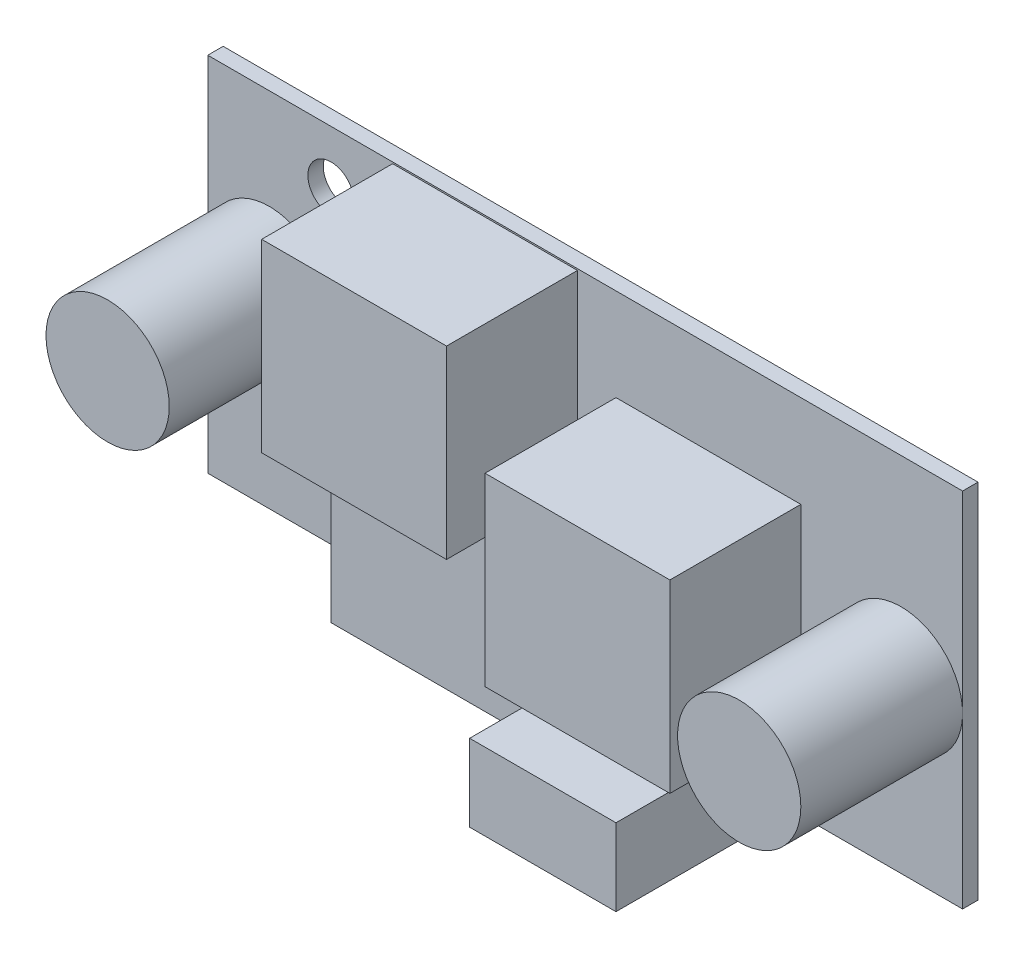
ISO-10303-21;
HEADER;
FILE_DESCRIPTION(('STEP AP214'),'2;1');
FILE_NAME('part.step','',(''),(''),'','','');
FILE_SCHEMA(('AUTOMOTIVE_DESIGN { 1 0 10303 214 1 1 1 1 }'));
ENDSEC;
DATA;
#1=APPLICATION_CONTEXT('core data for automotive mechanical design processes');
#2=APPLICATION_PROTOCOL_DEFINITION('international standard','automotive_design',2000,#1);
#3=PRODUCT_CONTEXT('',#1,'mechanical');
#4=PRODUCT('Part','Part','',(#3));
#5=PRODUCT_RELATED_PRODUCT_CATEGORY('part','',(#4));
#6=PRODUCT_DEFINITION_FORMATION('','',#4);
#7=PRODUCT_DEFINITION_CONTEXT('part definition',#1,'design');
#8=PRODUCT_DEFINITION('design','',#6,#7);
#9=PRODUCT_DEFINITION_SHAPE('','',#8);
#10=(LENGTH_UNIT() NAMED_UNIT(*) SI_UNIT(.MILLI.,.METRE.));
#11=(NAMED_UNIT(*) PLANE_ANGLE_UNIT() SI_UNIT($,.RADIAN.));
#12=(NAMED_UNIT(*) SI_UNIT($,.STERADIAN.) SOLID_ANGLE_UNIT());
#13=UNCERTAINTY_MEASURE_WITH_UNIT(LENGTH_MEASURE(1.E-05),#10,'distance_accuracy_value','');
#14=(GEOMETRIC_REPRESENTATION_CONTEXT(3) GLOBAL_UNCERTAINTY_ASSIGNED_CONTEXT((#13)) GLOBAL_UNIT_ASSIGNED_CONTEXT((#10,
#11,#12)) REPRESENTATION_CONTEXT('',''));
#15=CARTESIAN_POINT('',(0.,0.,0.));
#16=DIRECTION('',(0.,0.,1.));
#17=DIRECTION('',(1.,0.,0.));
#18=AXIS2_PLACEMENT_3D('',#15,#16,#17);
#19=CARTESIAN_POINT('',(0.,0.,1.));
#20=DIRECTION('',(0.,0.,1.));
#21=DIRECTION('',(1.,0.,0.));
#22=AXIS2_PLACEMENT_3D('',#19,#20,#21);
#23=PLANE('',#22);
#24=DIRECTION('',(0.,-1.,0.));
#25=VECTOR('',#24,1.);
#26=CARTESIAN_POINT('',(1.,0.,1.));
#27=LINE('',#26,#25);
#28=CARTESIAN_POINT('',(1.,-1.65,1.));
#29=VERTEX_POINT('',#28);
#30=CARTESIAN_POINT('',(1.,-11.65,1.));
#31=VERTEX_POINT('',#30);
#32=EDGE_CURVE('E200',#29,#31,#27,.T.);
#33=ORIENTED_EDGE('',*,*,#32,.T.);
#34=DIRECTION('',(1.,0.,0.));
#35=VECTOR('',#34,1.);
#36=CARTESIAN_POINT('',(0.,-11.65,1.));
#37=LINE('',#36,#35);
#38=CARTESIAN_POINT('',(-12.,-11.65,1.));
#39=VERTEX_POINT('',#38);
#40=EDGE_CURVE('E214',#39,#31,#37,.T.);
#41=ORIENTED_EDGE('',*,*,#40,.F.);
#42=DIRECTION('',(0.,-1.,0.));
#43=VECTOR('',#42,1.);
#44=CARTESIAN_POINT('',(-12.,0.,1.));
#45=LINE('',#44,#43);
#46=CARTESIAN_POINT('',(-12.,-1.65,1.));
#47=VERTEX_POINT('',#46);
#48=EDGE_CURVE('E227',#47,#39,#45,.T.);
#49=ORIENTED_EDGE('',*,*,#48,.F.);
#50=DIRECTION('',(1.,0.,0.));
#51=VECTOR('',#50,1.);
#52=CARTESIAN_POINT('',(0.,-1.65,1.));
#53=LINE('',#52,#51);
#54=EDGE_CURVE('E225',#47,#29,#53,.T.);
#55=ORIENTED_EDGE('',*,*,#54,.T.);
#56=EDGE_LOOP('',(#33,#41,#49,#55));
#57=FACE_BOUND('',#56,.T.);
#58=DIRECTION('',(0.,-1.,0.));
#59=VECTOR('',#58,1.);
#60=CARTESIAN_POINT('',(14.,0.,1.));
#61=LINE('',#60,#59);
#62=CARTESIAN_POINT('',(14.,5.75,1.));
#63=VERTEX_POINT('',#62);
#64=CARTESIAN_POINT('',(14.,-6.25,1.));
#65=VERTEX_POINT('',#64);
#66=EDGE_CURVE('E205',#63,#65,#61,.T.);
#67=ORIENTED_EDGE('',*,*,#66,.T.);
#68=DIRECTION('',(1.,0.,0.));
#69=VECTOR('',#68,1.);
#70=CARTESIAN_POINT('',(0.,-6.25,1.));
#71=LINE('',#70,#69);
#72=CARTESIAN_POINT('',(2.00000000000001,-6.25,1.));
#73=VERTEX_POINT('',#72);
#74=EDGE_CURVE('E237',#73,#65,#71,.T.);
#75=ORIENTED_EDGE('',*,*,#74,.F.);
#76=DIRECTION('',(0.,-1.,0.));
#77=VECTOR('',#76,1.);
#78=CARTESIAN_POINT('',(2.00000000000001,0.,1.));
#79=LINE('',#78,#77);
#80=CARTESIAN_POINT('',(2.00000000000001,5.75,1.));
#81=VERTEX_POINT('',#80);
#82=EDGE_CURVE('E250',#81,#73,#79,.T.);
#83=ORIENTED_EDGE('',*,*,#82,.F.);
#84=DIRECTION('',(1.,0.,0.));
#85=VECTOR('',#84,1.);
#86=CARTESIAN_POINT('',(0.,5.75,1.));
#87=LINE('',#86,#85);
#88=EDGE_CURVE('E247',#81,#63,#87,.T.);
#89=ORIENTED_EDGE('',*,*,#88,.T.);
#90=EDGE_LOOP('',(#67,#75,#83,#89));
#91=FACE_BOUND('',#90,.T.);
#92=DIRECTION('',(0.,-1.,0.));
#93=VECTOR('',#92,1.);
#94=CARTESIAN_POINT('',(-0.499999999999995,0.,1.));
#95=LINE('',#94,#93);
#96=CARTESIAN_POINT('',(-0.499999999999997,11.65,1.));
#97=VERTEX_POINT('',#96);
#98=CARTESIAN_POINT('',(-0.499999999999995,-0.349999999999999,1.));
#99=VERTEX_POINT('',#98);
#100=EDGE_CURVE('E259',#97,#99,#95,.T.);
#101=ORIENTED_EDGE('',*,*,#100,.T.);
#102=DIRECTION('',(1.,0.,0.));
#103=VECTOR('',#102,1.);
#104=CARTESIAN_POINT('',(0.,-0.349999999999999,1.));
#105=LINE('',#104,#103);
#106=CARTESIAN_POINT('',(-12.5,-0.349999999999999,1.));
#107=VERTEX_POINT('',#106);
#108=EDGE_CURVE('E264',#107,#99,#105,.T.);
#109=ORIENTED_EDGE('',*,*,#108,.F.);
#110=DIRECTION('',(0.,-1.,0.));
#111=VECTOR('',#110,1.);
#112=CARTESIAN_POINT('',(-12.5,0.,1.));
#113=LINE('',#112,#111);
#114=CARTESIAN_POINT('',(-12.5,11.65,1.));
#115=VERTEX_POINT('',#114);
#116=EDGE_CURVE('E277',#115,#107,#113,.T.);
#117=ORIENTED_EDGE('',*,*,#116,.F.);
#118=DIRECTION('',(1.,0.,0.));
#119=VECTOR('',#118,1.);
#120=CARTESIAN_POINT('',(0.,11.65,1.));
#121=LINE('',#120,#119);
#122=EDGE_CURVE('E274',#115,#97,#121,.T.);
#123=ORIENTED_EDGE('',*,*,#122,.T.);
#124=EDGE_LOOP('',(#101,#109,#117,#123));
#125=FACE_BOUND('',#124,.T.);
#126=DIRECTION('',(0.,-1.,0.));
#127=VECTOR('',#126,1.);
#128=CARTESIAN_POINT('',(13.5,0.,1.));
#129=LINE('',#128,#127);
#130=CARTESIAN_POINT('',(13.5,-6.65,1.));
#131=VERTEX_POINT('',#130);
#132=CARTESIAN_POINT('',(13.5,-11.65,1.));
#133=VERTEX_POINT('',#132);
#134=EDGE_CURVE('E289',#131,#133,#129,.T.);
#135=ORIENTED_EDGE('',*,*,#134,.T.);
#136=DIRECTION('',(1.,0.,0.));
#137=VECTOR('',#136,1.);
#138=CARTESIAN_POINT('',(0.,-11.65,1.));
#139=LINE('',#138,#137);
#140=CARTESIAN_POINT('',(4.00000000000001,-11.65,1.));
#141=VERTEX_POINT('',#140);
#142=EDGE_CURVE('E294',#141,#133,#139,.T.);
#143=ORIENTED_EDGE('',*,*,#142,.F.);
#144=DIRECTION('',(0.,-1.,0.));
#145=VECTOR('',#144,1.);
#146=CARTESIAN_POINT('',(4.00000000000001,0.,1.));
#147=LINE('',#146,#145);
#148=CARTESIAN_POINT('',(4.00000000000001,-6.65,1.));
#149=VERTEX_POINT('',#148);
#150=EDGE_CURVE('E307',#149,#141,#147,.T.);
#151=ORIENTED_EDGE('',*,*,#150,.F.);
#152=DIRECTION('',(1.,0.,0.));
#153=VECTOR('',#152,1.);
#154=CARTESIAN_POINT('',(0.,-6.65,1.));
#155=LINE('',#154,#153);
#156=EDGE_CURVE('E304',#149,#131,#155,.T.);
#157=ORIENTED_EDGE('',*,*,#156,.T.);
#158=EDGE_LOOP('',(#135,#143,#151,#157));
#159=FACE_BOUND('',#158,.T.);
#160=CARTESIAN_POINT('',(16.5,-8.25000000000001,1.));
#161=DIRECTION('',(0.,0.,1.));
#162=DIRECTION('',(1.,0.,0.));
#163=AXIS2_PLACEMENT_3D('',#160,#161,#162);
#164=CIRCLE('',#163,1.5);
#165=CARTESIAN_POINT('',(18.,-8.25000000000001,1.));
#166=VERTEX_POINT('',#165);
#167=EDGE_CURVE('E337',#166,#166,#164,.T.);
#168=ORIENTED_EDGE('',*,*,#167,.F.);
#169=EDGE_LOOP('',(#168));
#170=FACE_BOUND('',#169,.T.);
#171=DIRECTION('',(0.,1.,0.));
#172=VECTOR('',#171,1.);
#173=CARTESIAN_POINT('',(24.5,11.75,1.));
#174=LINE('',#173,#172);
#175=CARTESIAN_POINT('',(24.5,-11.75,1.));
#176=VERTEX_POINT('',#175);
#177=CARTESIAN_POINT('',(24.5,-0.749999999999999,1.));
#178=VERTEX_POINT('',#177);
#179=EDGE_CURVE('E343',#176,#178,#174,.T.);
#180=ORIENTED_EDGE('',*,*,#179,.T.);
#181=CARTESIAN_POINT('',(20.5,-0.749999999999999,1.));
#182=DIRECTION('',(0.,0.,1.));
#183=DIRECTION('',(1.,0.,0.));
#184=AXIS2_PLACEMENT_3D('',#181,#182,#183);
#185=CIRCLE('',#184,4.);
#186=EDGE_CURVE('E320',#178,#178,#185,.T.);
#187=ORIENTED_EDGE('',*,*,#186,.F.);
#188=CARTESIAN_POINT('',(24.5,11.75,1.));
#189=VERTEX_POINT('',#188);
#190=EDGE_CURVE('E347',#178,#189,#174,.T.);
#191=ORIENTED_EDGE('',*,*,#190,.T.);
#192=DIRECTION('',(-1.,0.,0.));
#193=VECTOR('',#192,1.);
#194=CARTESIAN_POINT('',(-24.5,11.75,1.));
#195=LINE('',#194,#193);
#196=CARTESIAN_POINT('',(-24.5,11.75,1.));
#197=VERTEX_POINT('',#196);
#198=EDGE_CURVE('E346',#189,#197,#195,.T.);
#199=ORIENTED_EDGE('',*,*,#198,.T.);
#200=DIRECTION('',(0.,-1.,0.));
#201=VECTOR('',#200,1.);
#202=CARTESIAN_POINT('',(-24.5,11.75,1.));
#203=LINE('',#202,#201);
#204=CARTESIAN_POINT('',(-24.5,1.25,1.));
#205=VERTEX_POINT('',#204);
#206=EDGE_CURVE('E350',#197,#205,#203,.T.);
#207=ORIENTED_EDGE('',*,*,#206,.T.);
#208=CARTESIAN_POINT('',(-20.5,1.25,1.));
#209=DIRECTION('',(0.,0.,1.));
#210=DIRECTION('',(1.,0.,0.));
#211=AXIS2_PLACEMENT_3D('',#208,#209,#210);
#212=CIRCLE('',#211,4.);
#213=EDGE_CURVE('E322',#205,#205,#212,.T.);
#214=ORIENTED_EDGE('',*,*,#213,.F.);
#215=CARTESIAN_POINT('',(-24.5,-11.75,1.));
#216=VERTEX_POINT('',#215);
#217=EDGE_CURVE('E349',#205,#216,#203,.T.);
#218=ORIENTED_EDGE('',*,*,#217,.T.);
#219=DIRECTION('',(1.,0.,0.));
#220=VECTOR('',#219,1.);
#221=CARTESIAN_POINT('',(-24.5,-11.75,1.));
#222=LINE('',#221,#220);
#223=EDGE_CURVE('E352',#216,#176,#222,.T.);
#224=ORIENTED_EDGE('',*,*,#223,.T.);
#225=EDGE_LOOP('',(#180,#187,#191,#199,#207,#214,#218,#224));
#226=FACE_BOUND('',#225,.T.);
#227=CARTESIAN_POINT('',(-16.5,8.25,1.));
#228=DIRECTION('',(0.,0.,1.));
#229=DIRECTION('',(1.,0.,0.));
#230=AXIS2_PLACEMENT_3D('',#227,#228,#229);
#231=CIRCLE('',#230,1.5);
#232=CARTESIAN_POINT('',(-15.,8.25,1.));
#233=VERTEX_POINT('',#232);
#234=EDGE_CURVE('E331',#233,#233,#231,.T.);
#235=ORIENTED_EDGE('',*,*,#234,.F.);
#236=EDGE_LOOP('',(#235));
#237=FACE_BOUND('',#236,.T.);
#238=ADVANCED_FACE('F48',(#57,#91,#125,#159,#170,#226,#237),#23,.T.);
#239=CARTESIAN_POINT('',(0.,0.,0.));
#240=DIRECTION('',(0.,0.,1.));
#241=DIRECTION('',(1.,0.,0.));
#242=AXIS2_PLACEMENT_3D('',#239,#240,#241);
#243=PLANE('',#242);
#244=DIRECTION('',(0.,1.,0.));
#245=VECTOR('',#244,1.);
#246=CARTESIAN_POINT('',(24.5,11.75,0.));
#247=LINE('',#246,#245);
#248=CARTESIAN_POINT('',(24.5,-11.75,0.));
#249=VERTEX_POINT('',#248);
#250=CARTESIAN_POINT('',(24.5,11.75,0.));
#251=VERTEX_POINT('',#250);
#252=EDGE_CURVE('E340',#249,#251,#247,.T.);
#253=ORIENTED_EDGE('',*,*,#252,.F.);
#254=DIRECTION('',(1.,0.,0.));
#255=VECTOR('',#254,1.);
#256=CARTESIAN_POINT('',(-24.5,-11.75,0.));
#257=LINE('',#256,#255);
#258=CARTESIAN_POINT('',(-24.5,-11.75,0.));
#259=VERTEX_POINT('',#258);
#260=EDGE_CURVE('E361',#259,#249,#257,.T.);
#261=ORIENTED_EDGE('',*,*,#260,.F.);
#262=DIRECTION('',(0.,-1.,0.));
#263=VECTOR('',#262,1.);
#264=CARTESIAN_POINT('',(-24.5,11.75,0.));
#265=LINE('',#264,#263);
#266=CARTESIAN_POINT('',(-24.5,11.75,0.));
#267=VERTEX_POINT('',#266);
#268=EDGE_CURVE('E359',#267,#259,#265,.T.);
#269=ORIENTED_EDGE('',*,*,#268,.F.);
#270=DIRECTION('',(-1.,0.,0.));
#271=VECTOR('',#270,1.);
#272=CARTESIAN_POINT('',(-24.5,11.75,0.));
#273=LINE('',#272,#271);
#274=EDGE_CURVE('E357',#251,#267,#273,.T.);
#275=ORIENTED_EDGE('',*,*,#274,.F.);
#276=EDGE_LOOP('',(#253,#261,#269,#275));
#277=FACE_BOUND('',#276,.T.);
#278=CARTESIAN_POINT('',(16.5,-8.25000000000001,0.));
#279=DIRECTION('',(0.,0.,1.));
#280=DIRECTION('',(1.,0.,0.));
#281=AXIS2_PLACEMENT_3D('',#278,#279,#280);
#282=CIRCLE('',#281,1.5);
#283=CARTESIAN_POINT('',(18.,-8.25000000000001,0.));
#284=VERTEX_POINT('',#283);
#285=EDGE_CURVE('E334',#284,#284,#282,.T.);
#286=ORIENTED_EDGE('',*,*,#285,.T.);
#287=EDGE_LOOP('',(#286));
#288=FACE_BOUND('',#287,.T.);
#289=CARTESIAN_POINT('',(-16.5,8.25,0.));
#290=DIRECTION('',(0.,0.,1.));
#291=DIRECTION('',(1.,0.,0.));
#292=AXIS2_PLACEMENT_3D('',#289,#290,#291);
#293=CIRCLE('',#292,1.5);
#294=CARTESIAN_POINT('',(-15.,8.25,0.));
#295=VERTEX_POINT('',#294);
#296=EDGE_CURVE('E328',#295,#295,#293,.T.);
#297=ORIENTED_EDGE('',*,*,#296,.T.);
#298=EDGE_LOOP('',(#297));
#299=FACE_BOUND('',#298,.T.);
#300=ADVANCED_FACE('F380',(#277,#288,#299),#243,.F.);
#301=CARTESIAN_POINT('',(24.5,11.75,1.));
#302=DIRECTION('',(-1.,0.,0.));
#303=DIRECTION('',(0.,0.,1.));
#304=AXIS2_PLACEMENT_3D('',#301,#302,#303);
#305=PLANE('',#304);
#306=ORIENTED_EDGE('',*,*,#252,.T.);
#307=DIRECTION('',(0.,0.,-1.));
#308=VECTOR('',#307,1.);
#309=CARTESIAN_POINT('',(24.5,11.75,1.));
#310=LINE('',#309,#308);
#311=EDGE_CURVE('E12',#189,#251,#310,.T.);
#312=ORIENTED_EDGE('',*,*,#311,.F.);
#313=ORIENTED_EDGE('',*,*,#190,.F.);
#314=ORIENTED_EDGE('',*,*,#179,.F.);
#315=DIRECTION('',(0.,0.,-1.));
#316=VECTOR('',#315,1.);
#317=CARTESIAN_POINT('',(24.5,-11.75,1.));
#318=LINE('',#317,#316);
#319=EDGE_CURVE('E354',#176,#249,#318,.T.);
#320=ORIENTED_EDGE('',*,*,#319,.T.);
#321=EDGE_LOOP('',(#306,#312,#313,#314,#320));
#322=FACE_BOUND('',#321,.T.);
#323=ADVANCED_FACE('F50',(#322),#305,.F.);
#324=CARTESIAN_POINT('',(-24.5,11.75,1.));
#325=DIRECTION('',(0.,-1.,0.));
#326=DIRECTION('',(0.,0.,-1.));
#327=AXIS2_PLACEMENT_3D('',#324,#325,#326);
#328=PLANE('',#327);
#329=ORIENTED_EDGE('',*,*,#274,.T.);
#330=DIRECTION('',(0.,0.,-1.));
#331=VECTOR('',#330,1.);
#332=CARTESIAN_POINT('',(-24.5,11.75,1.));
#333=LINE('',#332,#331);
#334=EDGE_CURVE('E56',#197,#267,#333,.T.);
#335=ORIENTED_EDGE('',*,*,#334,.F.);
#336=ORIENTED_EDGE('',*,*,#198,.F.);
#337=ORIENTED_EDGE('',*,*,#311,.T.);
#338=EDGE_LOOP('',(#329,#335,#336,#337));
#339=FACE_BOUND('',#338,.T.);
#340=ADVANCED_FACE('F425',(#339),#328,.F.);
#341=CARTESIAN_POINT('',(-24.5,11.75,1.));
#342=DIRECTION('',(1.,0.,0.));
#343=DIRECTION('',(0.,1.,0.));
#344=AXIS2_PLACEMENT_3D('',#341,#342,#343);
#345=PLANE('',#344);
#346=ORIENTED_EDGE('',*,*,#268,.T.);
#347=DIRECTION('',(0.,0.,-1.));
#348=VECTOR('',#347,1.);
#349=CARTESIAN_POINT('',(-24.5,-11.75,1.));
#350=LINE('',#349,#348);
#351=EDGE_CURVE('E365',#216,#259,#350,.T.);
#352=ORIENTED_EDGE('',*,*,#351,.F.);
#353=ORIENTED_EDGE('',*,*,#217,.F.);
#354=ORIENTED_EDGE('',*,*,#206,.F.);
#355=ORIENTED_EDGE('',*,*,#334,.T.);
#356=EDGE_LOOP('',(#346,#352,#353,#354,#355));
#357=FACE_BOUND('',#356,.T.);
#358=ADVANCED_FACE('F372',(#357),#345,.F.);
#359=CARTESIAN_POINT('',(-24.5,-11.75,1.));
#360=DIRECTION('',(0.,1.,0.));
#361=DIRECTION('',(0.,0.,1.));
#362=AXIS2_PLACEMENT_3D('',#359,#360,#361);
#363=PLANE('',#362);
#364=ORIENTED_EDGE('',*,*,#260,.T.);
#365=ORIENTED_EDGE('',*,*,#319,.F.);
#366=ORIENTED_EDGE('',*,*,#223,.F.);
#367=ORIENTED_EDGE('',*,*,#351,.T.);
#368=EDGE_LOOP('',(#364,#365,#366,#367));
#369=FACE_BOUND('',#368,.T.);
#370=ADVANCED_FACE('F384',(#369),#363,.F.);
#371=CARTESIAN_POINT('',(16.5,-8.25000000000001,1.));
#372=DIRECTION('',(0.,0.,-1.));
#373=DIRECTION('',(-1.,0.,0.));
#374=AXIS2_PLACEMENT_3D('',#371,#372,#373);
#375=CYLINDRICAL_SURFACE('',#374,1.5);
#376=ORIENTED_EDGE('',*,*,#167,.T.);
#377=EDGE_LOOP('',(#376));
#378=FACE_BOUND('',#377,.T.);
#379=ORIENTED_EDGE('',*,*,#285,.F.);
#380=EDGE_LOOP('',(#379));
#381=FACE_BOUND('',#380,.T.);
#382=ADVANCED_FACE('F408',(#378,#381),#375,.F.);
#383=CARTESIAN_POINT('',(-16.5,8.25,1.));
#384=DIRECTION('',(0.,0.,-1.));
#385=DIRECTION('',(-1.,0.,0.));
#386=AXIS2_PLACEMENT_3D('',#383,#384,#385);
#387=CYLINDRICAL_SURFACE('',#386,1.5);
#388=ORIENTED_EDGE('',*,*,#234,.T.);
#389=EDGE_LOOP('',(#388));
#390=FACE_BOUND('',#389,.T.);
#391=ORIENTED_EDGE('',*,*,#296,.F.);
#392=EDGE_LOOP('',(#391));
#393=FACE_BOUND('',#392,.T.);
#394=ADVANCED_FACE('F398',(#390,#393),#387,.F.);
#395=CARTESIAN_POINT('',(-20.5,1.25,11.5));
#396=DIRECTION('',(0.,0.,-1.));
#397=DIRECTION('',(-1.,0.,0.));
#398=AXIS2_PLACEMENT_3D('',#395,#396,#397);
#399=CYLINDRICAL_SURFACE('',#398,4.);
#400=CARTESIAN_POINT('',(-20.5,1.25,11.5));
#401=DIRECTION('',(0.,0.,1.));
#402=DIRECTION('',(1.,0.,0.));
#403=AXIS2_PLACEMENT_3D('',#400,#401,#402);
#404=CIRCLE('',#403,4.);
#405=CARTESIAN_POINT('',(-16.5,1.25,11.5));
#406=VERTEX_POINT('',#405);
#407=EDGE_CURVE('E325',#406,#406,#404,.T.);
#408=ORIENTED_EDGE('',*,*,#407,.F.);
#409=EDGE_LOOP('',(#408));
#410=FACE_BOUND('',#409,.T.);
#411=ORIENTED_EDGE('',*,*,#213,.T.);
#412=EDGE_LOOP('',(#411));
#413=FACE_BOUND('',#412,.T.);
#414=ADVANCED_FACE('F395',(#410,#413),#399,.T.);
#415=CARTESIAN_POINT('',(0.,0.,11.5));
#416=DIRECTION('',(0.,0.,1.));
#417=DIRECTION('',(1.,0.,0.));
#418=AXIS2_PLACEMENT_3D('',#415,#416,#417);
#419=PLANE('',#418);
#420=ORIENTED_EDGE('',*,*,#407,.T.);
#421=EDGE_LOOP('',(#420));
#422=FACE_BOUND('',#421,.T.);
#423=ADVANCED_FACE('F397',(#422),#419,.T.);
#424=CARTESIAN_POINT('',(20.5,-0.749999999999999,11.5));
#425=DIRECTION('',(0.,0.,-1.));
#426=DIRECTION('',(-1.,0.,0.));
#427=AXIS2_PLACEMENT_3D('',#424,#425,#426);
#428=CYLINDRICAL_SURFACE('',#427,4.);
#429=CARTESIAN_POINT('',(20.5,-0.749999999999999,11.5));
#430=DIRECTION('',(0.,0.,1.));
#431=DIRECTION('',(1.,0.,0.));
#432=AXIS2_PLACEMENT_3D('',#429,#430,#431);
#433=CIRCLE('',#432,4.);
#434=CARTESIAN_POINT('',(24.5,-0.749999999999999,11.5));
#435=VERTEX_POINT('',#434);
#436=EDGE_CURVE('E319',#435,#435,#433,.T.);
#437=ORIENTED_EDGE('',*,*,#436,.F.);
#438=EDGE_LOOP('',(#437));
#439=FACE_BOUND('',#438,.T.);
#440=ORIENTED_EDGE('',*,*,#186,.T.);
#441=EDGE_LOOP('',(#440));
#442=FACE_BOUND('',#441,.T.);
#443=ADVANCED_FACE('F405',(#439,#442),#428,.T.);
#444=CARTESIAN_POINT('',(0.,0.,11.5));
#445=DIRECTION('',(0.,0.,1.));
#446=DIRECTION('',(1.,0.,0.));
#447=AXIS2_PLACEMENT_3D('',#444,#445,#446);
#448=PLANE('',#447);
#449=ORIENTED_EDGE('',*,*,#436,.T.);
#450=EDGE_LOOP('',(#449));
#451=FACE_BOUND('',#450,.T.);
#452=ADVANCED_FACE('F488',(#451),#448,.T.);
#453=CARTESIAN_POINT('',(13.5,0.,12.5));
#454=DIRECTION('',(1.,0.,0.));
#455=DIRECTION('',(0.,0.,-1.));
#456=AXIS2_PLACEMENT_3D('',#453,#454,#455);
#457=PLANE('',#456);
#458=ORIENTED_EDGE('',*,*,#134,.F.);
#459=DIRECTION('',(0.,0.,-1.));
#460=VECTOR('',#459,1.);
#461=CARTESIAN_POINT('',(13.5,-6.65,12.5));
#462=LINE('',#461,#460);
#463=CARTESIAN_POINT('',(13.5,-6.65,12.5));
#464=VERTEX_POINT('',#463);
#465=EDGE_CURVE('E317',#464,#131,#462,.T.);
#466=ORIENTED_EDGE('',*,*,#465,.F.);
#467=DIRECTION('',(0.,-1.,0.));
#468=VECTOR('',#467,1.);
#469=CARTESIAN_POINT('',(13.5,0.,12.5));
#470=LINE('',#469,#468);
#471=CARTESIAN_POINT('',(13.5,-11.65,12.5));
#472=VERTEX_POINT('',#471);
#473=EDGE_CURVE('E290',#464,#472,#470,.T.);
#474=ORIENTED_EDGE('',*,*,#473,.T.);
#475=DIRECTION('',(0.,0.,-1.));
#476=VECTOR('',#475,1.);
#477=CARTESIAN_POINT('',(13.5,-11.65,12.5));
#478=LINE('',#477,#476);
#479=EDGE_CURVE('E301',#472,#133,#478,.T.);
#480=ORIENTED_EDGE('',*,*,#479,.T.);
#481=EDGE_LOOP('',(#458,#466,#474,#480));
#482=FACE_BOUND('',#481,.T.);
#483=ADVANCED_FACE('F500',(#482),#457,.T.);
#484=CARTESIAN_POINT('',(0.,-6.65,12.5));
#485=DIRECTION('',(0.,1.,0.));
#486=DIRECTION('',(0.,0.,1.));
#487=AXIS2_PLACEMENT_3D('',#484,#485,#486);
#488=PLANE('',#487);
#489=ORIENTED_EDGE('',*,*,#156,.F.);
#490=DIRECTION('',(0.,0.,-1.));
#491=VECTOR('',#490,1.);
#492=CARTESIAN_POINT('',(4.00000000000001,-6.65,12.5));
#493=LINE('',#492,#491);
#494=CARTESIAN_POINT('',(4.00000000000001,-6.65,12.5));
#495=VERTEX_POINT('',#494);
#496=EDGE_CURVE('E315',#495,#149,#493,.T.);
#497=ORIENTED_EDGE('',*,*,#496,.F.);
#498=DIRECTION('',(1.,0.,0.));
#499=VECTOR('',#498,1.);
#500=CARTESIAN_POINT('',(0.,-6.65,12.5));
#501=LINE('',#500,#499);
#502=EDGE_CURVE('E293',#495,#464,#501,.T.);
#503=ORIENTED_EDGE('',*,*,#502,.T.);
#504=ORIENTED_EDGE('',*,*,#465,.T.);
#505=EDGE_LOOP('',(#489,#497,#503,#504));
#506=FACE_BOUND('',#505,.T.);
#507=ADVANCED_FACE('F512',(#506),#488,.T.);
#508=CARTESIAN_POINT('',(4.00000000000001,0.,12.5));
#509=DIRECTION('',(1.,0.,0.));
#510=DIRECTION('',(0.,1.,0.));
#511=AXIS2_PLACEMENT_3D('',#508,#509,#510);
#512=PLANE('',#511);
#513=ORIENTED_EDGE('',*,*,#150,.T.);
#514=DIRECTION('',(0.,0.,-1.));
#515=VECTOR('',#514,1.);
#516=CARTESIAN_POINT('',(4.00000000000001,-11.65,12.5));
#517=LINE('',#516,#515);
#518=CARTESIAN_POINT('',(4.00000000000001,-11.65,12.5));
#519=VERTEX_POINT('',#518);
#520=EDGE_CURVE('E313',#519,#141,#517,.T.);
#521=ORIENTED_EDGE('',*,*,#520,.F.);
#522=DIRECTION('',(0.,-1.,0.));
#523=VECTOR('',#522,1.);
#524=CARTESIAN_POINT('',(4.00000000000001,0.,12.5));
#525=LINE('',#524,#523);
#526=EDGE_CURVE('E297',#495,#519,#525,.T.);
#527=ORIENTED_EDGE('',*,*,#526,.F.);
#528=ORIENTED_EDGE('',*,*,#496,.T.);
#529=EDGE_LOOP('',(#513,#521,#527,#528));
#530=FACE_BOUND('',#529,.T.);
#531=ADVANCED_FACE('F521',(#530),#512,.F.);
#532=CARTESIAN_POINT('',(0.,-11.65,12.5));
#533=DIRECTION('',(0.,1.,0.));
#534=DIRECTION('',(0.,0.,1.));
#535=AXIS2_PLACEMENT_3D('',#532,#533,#534);
#536=PLANE('',#535);
#537=ORIENTED_EDGE('',*,*,#142,.T.);
#538=ORIENTED_EDGE('',*,*,#479,.F.);
#539=DIRECTION('',(1.,0.,0.));
#540=VECTOR('',#539,1.);
#541=CARTESIAN_POINT('',(0.,-11.65,12.5));
#542=LINE('',#541,#540);
#543=EDGE_CURVE('E299',#519,#472,#542,.T.);
#544=ORIENTED_EDGE('',*,*,#543,.F.);
#545=ORIENTED_EDGE('',*,*,#520,.T.);
#546=EDGE_LOOP('',(#537,#538,#544,#545));
#547=FACE_BOUND('',#546,.T.);
#548=ADVANCED_FACE('F530',(#547),#536,.F.);
#549=CARTESIAN_POINT('',(0.,0.,12.5));
#550=DIRECTION('',(0.,0.,1.));
#551=DIRECTION('',(1.,0.,0.));
#552=AXIS2_PLACEMENT_3D('',#549,#550,#551);
#553=PLANE('',#552);
#554=ORIENTED_EDGE('',*,*,#473,.F.);
#555=ORIENTED_EDGE('',*,*,#502,.F.);
#556=ORIENTED_EDGE('',*,*,#526,.T.);
#557=ORIENTED_EDGE('',*,*,#543,.T.);
#558=EDGE_LOOP('',(#554,#555,#556,#557));
#559=FACE_BOUND('',#558,.T.);
#560=ADVANCED_FACE('F539',(#559),#553,.T.);
#561=CARTESIAN_POINT('',(-0.499999999999995,0.,9.5));
#562=DIRECTION('',(1.,0.,0.));
#563=DIRECTION('',(0.,1.,0.));
#564=AXIS2_PLACEMENT_3D('',#561,#562,#563);
#565=PLANE('',#564);
#566=ORIENTED_EDGE('',*,*,#100,.F.);
#567=DIRECTION('',(0.,0.,-1.));
#568=VECTOR('',#567,1.);
#569=CARTESIAN_POINT('',(-0.499999999999997,11.65,9.5));
#570=LINE('',#569,#568);
#571=CARTESIAN_POINT('',(-0.499999999999997,11.65,9.5));
#572=VERTEX_POINT('',#571);
#573=EDGE_CURVE('E287',#572,#97,#570,.T.);
#574=ORIENTED_EDGE('',*,*,#573,.F.);
#575=DIRECTION('',(0.,-1.,0.));
#576=VECTOR('',#575,1.);
#577=CARTESIAN_POINT('',(-0.499999999999995,0.,9.5));
#578=LINE('',#577,#576);
#579=CARTESIAN_POINT('',(-0.499999999999995,-0.349999999999999,9.5));
#580=VERTEX_POINT('',#579);
#581=EDGE_CURVE('E260',#572,#580,#578,.T.);
#582=ORIENTED_EDGE('',*,*,#581,.T.);
#583=DIRECTION('',(0.,0.,-1.));
#584=VECTOR('',#583,1.);
#585=CARTESIAN_POINT('',(-0.499999999999995,-0.349999999999999,9.5));
#586=LINE('',#585,#584);
#587=EDGE_CURVE('E271',#580,#99,#586,.T.);
#588=ORIENTED_EDGE('',*,*,#587,.T.);
#589=EDGE_LOOP('',(#566,#574,#582,#588));
#590=FACE_BOUND('',#589,.T.);
#591=ADVANCED_FACE('F548',(#590),#565,.T.);
#592=CARTESIAN_POINT('',(0.,11.65,9.5));
#593=DIRECTION('',(0.,1.,0.));
#594=DIRECTION('',(0.,0.,1.));
#595=AXIS2_PLACEMENT_3D('',#592,#593,#594);
#596=PLANE('',#595);
#597=ORIENTED_EDGE('',*,*,#122,.F.);
#598=DIRECTION('',(0.,0.,-1.));
#599=VECTOR('',#598,1.);
#600=CARTESIAN_POINT('',(-12.5,11.65,9.5));
#601=LINE('',#600,#599);
#602=CARTESIAN_POINT('',(-12.5,11.65,9.5));
#603=VERTEX_POINT('',#602);
#604=EDGE_CURVE('E285',#603,#115,#601,.T.);
#605=ORIENTED_EDGE('',*,*,#604,.F.);
#606=DIRECTION('',(1.,0.,0.));
#607=VECTOR('',#606,1.);
#608=CARTESIAN_POINT('',(0.,11.65,9.5));
#609=LINE('',#608,#607);
#610=EDGE_CURVE('E263',#603,#572,#609,.T.);
#611=ORIENTED_EDGE('',*,*,#610,.T.);
#612=ORIENTED_EDGE('',*,*,#573,.T.);
#613=EDGE_LOOP('',(#597,#605,#611,#612));
#614=FACE_BOUND('',#613,.T.);
#615=ADVANCED_FACE('F557',(#614),#596,.T.);
#616=CARTESIAN_POINT('',(-12.5,0.,9.5));
#617=DIRECTION('',(1.,0.,0.));
#618=DIRECTION('',(0.,1.,0.));
#619=AXIS2_PLACEMENT_3D('',#616,#617,#618);
#620=PLANE('',#619);
#621=ORIENTED_EDGE('',*,*,#116,.T.);
#622=DIRECTION('',(0.,0.,-1.));
#623=VECTOR('',#622,1.);
#624=CARTESIAN_POINT('',(-12.5,-0.349999999999999,9.5));
#625=LINE('',#624,#623);
#626=CARTESIAN_POINT('',(-12.5,-0.349999999999999,9.5));
#627=VERTEX_POINT('',#626);
#628=EDGE_CURVE('E283',#627,#107,#625,.T.);
#629=ORIENTED_EDGE('',*,*,#628,.F.);
#630=DIRECTION('',(0.,-1.,0.));
#631=VECTOR('',#630,1.);
#632=CARTESIAN_POINT('',(-12.5,0.,9.5));
#633=LINE('',#632,#631);
#634=EDGE_CURVE('E267',#603,#627,#633,.T.);
#635=ORIENTED_EDGE('',*,*,#634,.F.);
#636=ORIENTED_EDGE('',*,*,#604,.T.);
#637=EDGE_LOOP('',(#621,#629,#635,#636));
#638=FACE_BOUND('',#637,.T.);
#639=ADVANCED_FACE('F566',(#638),#620,.F.);
#640=CARTESIAN_POINT('',(0.,-0.349999999999999,9.5));
#641=DIRECTION('',(0.,1.,0.));
#642=DIRECTION('',(0.,0.,1.));
#643=AXIS2_PLACEMENT_3D('',#640,#641,#642);
#644=PLANE('',#643);
#645=ORIENTED_EDGE('',*,*,#108,.T.);
#646=ORIENTED_EDGE('',*,*,#587,.F.);
#647=DIRECTION('',(1.,0.,0.));
#648=VECTOR('',#647,1.);
#649=CARTESIAN_POINT('',(0.,-0.349999999999999,9.5));
#650=LINE('',#649,#648);
#651=EDGE_CURVE('E269',#627,#580,#650,.T.);
#652=ORIENTED_EDGE('',*,*,#651,.F.);
#653=ORIENTED_EDGE('',*,*,#628,.T.);
#654=EDGE_LOOP('',(#645,#646,#652,#653));
#655=FACE_BOUND('',#654,.T.);
#656=ADVANCED_FACE('F575',(#655),#644,.F.);
#657=CARTESIAN_POINT('',(0.,0.,9.5));
#658=DIRECTION('',(0.,0.,1.));
#659=DIRECTION('',(1.,0.,0.));
#660=AXIS2_PLACEMENT_3D('',#657,#658,#659);
#661=PLANE('',#660);
#662=ORIENTED_EDGE('',*,*,#581,.F.);
#663=ORIENTED_EDGE('',*,*,#610,.F.);
#664=ORIENTED_EDGE('',*,*,#634,.T.);
#665=ORIENTED_EDGE('',*,*,#651,.T.);
#666=EDGE_LOOP('',(#662,#663,#664,#665));
#667=FACE_BOUND('',#666,.T.);
#668=ADVANCED_FACE('F584',(#667),#661,.T.);
#669=CARTESIAN_POINT('',(14.,0.,9.5));
#670=DIRECTION('',(1.,0.,0.));
#671=DIRECTION('',(0.,1.,0.));
#672=AXIS2_PLACEMENT_3D('',#669,#670,#671);
#673=PLANE('',#672);
#674=ORIENTED_EDGE('',*,*,#66,.F.);
#675=DIRECTION('',(0.,0.,-1.));
#676=VECTOR('',#675,1.);
#677=CARTESIAN_POINT('',(14.,5.75,9.5));
#678=LINE('',#677,#676);
#679=CARTESIAN_POINT('',(14.,5.75,9.5));
#680=VERTEX_POINT('',#679);
#681=EDGE_CURVE('E257',#680,#63,#678,.T.);
#682=ORIENTED_EDGE('',*,*,#681,.F.);
#683=DIRECTION('',(0.,-1.,0.));
#684=VECTOR('',#683,1.);
#685=CARTESIAN_POINT('',(14.,0.,9.5));
#686=LINE('',#685,#684);
#687=CARTESIAN_POINT('',(14.,-6.25,9.5));
#688=VERTEX_POINT('',#687);
#689=EDGE_CURVE('E233',#680,#688,#686,.T.);
#690=ORIENTED_EDGE('',*,*,#689,.T.);
#691=DIRECTION('',(0.,0.,-1.));
#692=VECTOR('',#691,1.);
#693=CARTESIAN_POINT('',(14.,-6.25,9.5));
#694=LINE('',#693,#692);
#695=EDGE_CURVE('E244',#688,#65,#694,.T.);
#696=ORIENTED_EDGE('',*,*,#695,.T.);
#697=EDGE_LOOP('',(#674,#682,#690,#696));
#698=FACE_BOUND('',#697,.T.);
#699=ADVANCED_FACE('F593',(#698),#673,.T.);
#700=CARTESIAN_POINT('',(0.,5.75,9.5));
#701=DIRECTION('',(0.,1.,0.));
#702=DIRECTION('',(0.,0.,1.));
#703=AXIS2_PLACEMENT_3D('',#700,#701,#702);
#704=PLANE('',#703);
#705=ORIENTED_EDGE('',*,*,#88,.F.);
#706=DIRECTION('',(0.,0.,-1.));
#707=VECTOR('',#706,1.);
#708=CARTESIAN_POINT('',(2.00000000000001,5.75,9.5));
#709=LINE('',#708,#707);
#710=CARTESIAN_POINT('',(2.00000000000001,5.75,9.5));
#711=VERTEX_POINT('',#710);
#712=EDGE_CURVE('E255',#711,#81,#709,.T.);
#713=ORIENTED_EDGE('',*,*,#712,.F.);
#714=DIRECTION('',(1.,0.,0.));
#715=VECTOR('',#714,1.);
#716=CARTESIAN_POINT('',(0.,5.75,9.5));
#717=LINE('',#716,#715);
#718=EDGE_CURVE('E236',#711,#680,#717,.T.);
#719=ORIENTED_EDGE('',*,*,#718,.T.);
#720=ORIENTED_EDGE('',*,*,#681,.T.);
#721=EDGE_LOOP('',(#705,#713,#719,#720));
#722=FACE_BOUND('',#721,.T.);
#723=ADVANCED_FACE('F602',(#722),#704,.T.);
#724=CARTESIAN_POINT('',(2.00000000000001,0.,9.5));
#725=DIRECTION('',(1.,0.,0.));
#726=DIRECTION('',(0.,1.,0.));
#727=AXIS2_PLACEMENT_3D('',#724,#725,#726);
#728=PLANE('',#727);
#729=ORIENTED_EDGE('',*,*,#82,.T.);
#730=DIRECTION('',(0.,0.,-1.));
#731=VECTOR('',#730,1.);
#732=CARTESIAN_POINT('',(2.00000000000001,-6.25,9.5));
#733=LINE('',#732,#731);
#734=CARTESIAN_POINT('',(2.00000000000001,-6.25,9.5));
#735=VERTEX_POINT('',#734);
#736=EDGE_CURVE('E71',#735,#73,#733,.T.);
#737=ORIENTED_EDGE('',*,*,#736,.F.);
#738=DIRECTION('',(0.,-1.,0.));
#739=VECTOR('',#738,1.);
#740=CARTESIAN_POINT('',(2.00000000000001,0.,9.5));
#741=LINE('',#740,#739);
#742=EDGE_CURVE('E240',#711,#735,#741,.T.);
#743=ORIENTED_EDGE('',*,*,#742,.F.);
#744=ORIENTED_EDGE('',*,*,#712,.T.);
#745=EDGE_LOOP('',(#729,#737,#743,#744));
#746=FACE_BOUND('',#745,.T.);
#747=ADVANCED_FACE('F611',(#746),#728,.F.);
#748=CARTESIAN_POINT('',(0.,-6.25,9.5));
#749=DIRECTION('',(0.,1.,0.));
#750=DIRECTION('',(0.,0.,1.));
#751=AXIS2_PLACEMENT_3D('',#748,#749,#750);
#752=PLANE('',#751);
#753=ORIENTED_EDGE('',*,*,#74,.T.);
#754=ORIENTED_EDGE('',*,*,#695,.F.);
#755=DIRECTION('',(1.,0.,0.));
#756=VECTOR('',#755,1.);
#757=CARTESIAN_POINT('',(0.,-6.25,9.5));
#758=LINE('',#757,#756);
#759=EDGE_CURVE('E242',#735,#688,#758,.T.);
#760=ORIENTED_EDGE('',*,*,#759,.F.);
#761=ORIENTED_EDGE('',*,*,#736,.T.);
#762=EDGE_LOOP('',(#753,#754,#760,#761));
#763=FACE_BOUND('',#762,.T.);
#764=ADVANCED_FACE('F620',(#763),#752,.F.);
#765=CARTESIAN_POINT('',(0.,0.,9.5));
#766=DIRECTION('',(0.,0.,1.));
#767=DIRECTION('',(1.,0.,0.));
#768=AXIS2_PLACEMENT_3D('',#765,#766,#767);
#769=PLANE('',#768);
#770=ORIENTED_EDGE('',*,*,#689,.F.);
#771=ORIENTED_EDGE('',*,*,#718,.F.);
#772=ORIENTED_EDGE('',*,*,#742,.T.);
#773=ORIENTED_EDGE('',*,*,#759,.T.);
#774=EDGE_LOOP('',(#770,#771,#772,#773));
#775=FACE_BOUND('',#774,.T.);
#776=ADVANCED_FACE('F629',(#775),#769,.T.);
#777=CARTESIAN_POINT('',(1.,0.,5.5));
#778=DIRECTION('',(1.,0.,0.));
#779=DIRECTION('',(0.,1.,0.));
#780=AXIS2_PLACEMENT_3D('',#777,#778,#779);
#781=PLANE('',#780);
#782=ORIENTED_EDGE('',*,*,#32,.F.);
#783=DIRECTION('',(0.,0.,-1.));
#784=VECTOR('',#783,1.);
#785=CARTESIAN_POINT('',(1.,-1.65,5.5));
#786=LINE('',#785,#784);
#787=CARTESIAN_POINT('',(1.,-1.65,5.5));
#788=VERTEX_POINT('',#787);
#789=EDGE_CURVE('E195',#788,#29,#786,.T.);
#790=ORIENTED_EDGE('',*,*,#789,.F.);
#791=DIRECTION('',(0.,-1.,0.));
#792=VECTOR('',#791,1.);
#793=CARTESIAN_POINT('',(1.,0.,5.5));
#794=LINE('',#793,#792);
#795=CARTESIAN_POINT('',(1.,-11.65,5.5));
#796=VERTEX_POINT('',#795);
#797=EDGE_CURVE('E198',#788,#796,#794,.T.);
#798=ORIENTED_EDGE('',*,*,#797,.T.);
#799=DIRECTION('',(0.,0.,-1.));
#800=VECTOR('',#799,1.);
#801=CARTESIAN_POINT('',(1.,-11.65,5.5));
#802=LINE('',#801,#800);
#803=EDGE_CURVE('E223',#796,#31,#802,.T.);
#804=ORIENTED_EDGE('',*,*,#803,.T.);
#805=EDGE_LOOP('',(#782,#790,#798,#804));
#806=FACE_BOUND('',#805,.T.);
#807=ADVANCED_FACE('F197',(#806),#781,.T.);
#808=CARTESIAN_POINT('',(0.,-1.65,5.5));
#809=DIRECTION('',(0.,1.,0.));
#810=DIRECTION('',(0.,0.,1.));
#811=AXIS2_PLACEMENT_3D('',#808,#809,#810);
#812=PLANE('',#811);
#813=ORIENTED_EDGE('',*,*,#54,.F.);
#814=DIRECTION('',(0.,0.,-1.));
#815=VECTOR('',#814,1.);
#816=CARTESIAN_POINT('',(-12.,-1.65,5.5));
#817=LINE('',#816,#815);
#818=CARTESIAN_POINT('',(-12.,-1.65,5.5));
#819=VERTEX_POINT('',#818);
#820=EDGE_CURVE('E206',#819,#47,#817,.T.);
#821=ORIENTED_EDGE('',*,*,#820,.F.);
#822=DIRECTION('',(1.,0.,0.));
#823=VECTOR('',#822,1.);
#824=CARTESIAN_POINT('',(0.,-1.65,5.5));
#825=LINE('',#824,#823);
#826=EDGE_CURVE('E211',#819,#788,#825,.T.);
#827=ORIENTED_EDGE('',*,*,#826,.T.);
#828=ORIENTED_EDGE('',*,*,#789,.T.);
#829=EDGE_LOOP('',(#813,#821,#827,#828));
#830=FACE_BOUND('',#829,.T.);
#831=ADVANCED_FACE('F216',(#830),#812,.T.);
#832=CARTESIAN_POINT('',(-12.,0.,5.5));
#833=DIRECTION('',(1.,0.,0.));
#834=DIRECTION('',(0.,1.,0.));
#835=AXIS2_PLACEMENT_3D('',#832,#833,#834);
#836=PLANE('',#835);
#837=ORIENTED_EDGE('',*,*,#48,.T.);
#838=DIRECTION('',(0.,0.,-1.));
#839=VECTOR('',#838,1.);
#840=CARTESIAN_POINT('',(-12.,-11.65,5.5));
#841=LINE('',#840,#839);
#842=CARTESIAN_POINT('',(-12.,-11.65,5.5));
#843=VERTEX_POINT('',#842);
#844=EDGE_CURVE('E63',#843,#39,#841,.T.);
#845=ORIENTED_EDGE('',*,*,#844,.F.);
#846=DIRECTION('',(0.,-1.,0.));
#847=VECTOR('',#846,1.);
#848=CARTESIAN_POINT('',(-12.,0.,5.5));
#849=LINE('',#848,#847);
#850=EDGE_CURVE('E218',#819,#843,#849,.T.);
#851=ORIENTED_EDGE('',*,*,#850,.F.);
#852=ORIENTED_EDGE('',*,*,#820,.T.);
#853=EDGE_LOOP('',(#837,#845,#851,#852));
#854=FACE_BOUND('',#853,.T.);
#855=ADVANCED_FACE('F652',(#854),#836,.F.);
#856=CARTESIAN_POINT('',(0.,-11.65,5.5));
#857=DIRECTION('',(0.,1.,0.));
#858=DIRECTION('',(0.,0.,1.));
#859=AXIS2_PLACEMENT_3D('',#856,#857,#858);
#860=PLANE('',#859);
#861=ORIENTED_EDGE('',*,*,#40,.T.);
#862=ORIENTED_EDGE('',*,*,#803,.F.);
#863=DIRECTION('',(1.,0.,0.));
#864=VECTOR('',#863,1.);
#865=CARTESIAN_POINT('',(0.,-11.65,5.5));
#866=LINE('',#865,#864);
#867=EDGE_CURVE('E212',#843,#796,#866,.T.);
#868=ORIENTED_EDGE('',*,*,#867,.F.);
#869=ORIENTED_EDGE('',*,*,#844,.T.);
#870=EDGE_LOOP('',(#861,#862,#868,#869));
#871=FACE_BOUND('',#870,.T.);
#872=ADVANCED_FACE('F660',(#871),#860,.F.);
#873=CARTESIAN_POINT('',(0.,0.,5.5));
#874=DIRECTION('',(0.,0.,1.));
#875=DIRECTION('',(1.,0.,0.));
#876=AXIS2_PLACEMENT_3D('',#873,#874,#875);
#877=PLANE('',#876);
#878=ORIENTED_EDGE('',*,*,#797,.F.);
#879=ORIENTED_EDGE('',*,*,#826,.F.);
#880=ORIENTED_EDGE('',*,*,#850,.T.);
#881=ORIENTED_EDGE('',*,*,#867,.T.);
#882=EDGE_LOOP('',(#878,#879,#880,#881));
#883=FACE_BOUND('',#882,.T.);
#884=ADVANCED_FACE('F210',(#883),#877,.T.);
#885=CLOSED_SHELL('',(#238,#300,#323,#340,#358,#370,#382,#394,#414,#423,#443,#452,#483,#507,
#531,#548,#560,#591,#615,#639,#656,#668,#699,#723,#747,#764,#776,#807,#831,#855,#872,#884));
#886=MANIFOLD_SOLID_BREP('B2',#885);
#887=ADVANCED_BREP_SHAPE_REPRESENTATION('',(#18,#886),#14);
#888=SHAPE_DEFINITION_REPRESENTATION(#9,#887);
ENDSEC;
END-ISO-10303-21;
